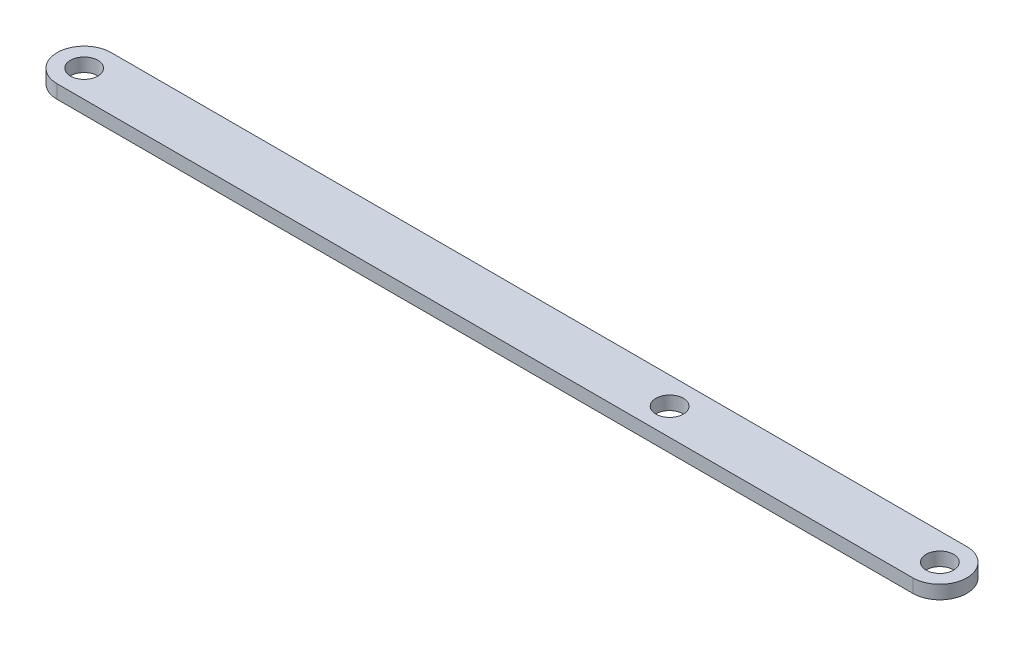
ISO-10303-21;
HEADER;
FILE_DESCRIPTION(('STEP AP214'),'2;1');
FILE_NAME('part.step','',(''),(''),'','','');
FILE_SCHEMA(('AUTOMOTIVE_DESIGN { 1 0 10303 214 1 1 1 1 }'));
ENDSEC;
DATA;
#1=APPLICATION_CONTEXT('core data for automotive mechanical design processes');
#2=APPLICATION_PROTOCOL_DEFINITION('international standard','automotive_design',2000,#1);
#3=PRODUCT_CONTEXT('',#1,'mechanical');
#4=PRODUCT('Part','Part','',(#3));
#5=PRODUCT_RELATED_PRODUCT_CATEGORY('part','',(#4));
#6=PRODUCT_DEFINITION_FORMATION('','',#4);
#7=PRODUCT_DEFINITION_CONTEXT('part definition',#1,'design');
#8=PRODUCT_DEFINITION('design','',#6,#7);
#9=PRODUCT_DEFINITION_SHAPE('','',#8);
#10=(LENGTH_UNIT() NAMED_UNIT(*) SI_UNIT(.MILLI.,.METRE.));
#11=(NAMED_UNIT(*) PLANE_ANGLE_UNIT() SI_UNIT($,.RADIAN.));
#12=(NAMED_UNIT(*) SI_UNIT($,.STERADIAN.) SOLID_ANGLE_UNIT());
#13=UNCERTAINTY_MEASURE_WITH_UNIT(LENGTH_MEASURE(1.E-05),#10,'distance_accuracy_value','');
#14=(GEOMETRIC_REPRESENTATION_CONTEXT(3) GLOBAL_UNCERTAINTY_ASSIGNED_CONTEXT((#13)) GLOBAL_UNIT_ASSIGNED_CONTEXT((#10,
#11,#12)) REPRESENTATION_CONTEXT('',''));
#15=CARTESIAN_POINT('',(0.,0.,0.));
#16=DIRECTION('',(0.,0.,1.));
#17=DIRECTION('',(1.,0.,0.));
#18=AXIS2_PLACEMENT_3D('',#15,#16,#17);
#19=CARTESIAN_POINT('',(0.,3.,0.));
#20=DIRECTION('',(0.,1.,0.));
#21=DIRECTION('',(0.,0.,1.));
#22=AXIS2_PLACEMENT_3D('',#19,#20,#21);
#23=PLANE('',#22);
#24=CARTESIAN_POINT('',(130.,3.,0.));
#25=DIRECTION('',(0.,1.,0.));
#26=DIRECTION('',(0.,0.,1.));
#27=AXIS2_PLACEMENT_3D('',#24,#25,#26);
#28=CIRCLE('',#27,3.04999999999999);
#29=CARTESIAN_POINT('',(130.,3.,3.04999999999999));
#30=VERTEX_POINT('',#29);
#31=EDGE_CURVE('E123',#30,#30,#28,.T.);
#32=ORIENTED_EDGE('',*,*,#31,.F.);
#33=EDGE_LOOP('',(#32));
#34=FACE_BOUND('',#33,.T.);
#35=CARTESIAN_POINT('',(0.,3.,0.));
#36=DIRECTION('',(0.,1.,0.));
#37=DIRECTION('',(0.,0.,1.));
#38=AXIS2_PLACEMENT_3D('',#35,#36,#37);
#39=CIRCLE('',#38,6.);
#40=CARTESIAN_POINT('',(0.,3.,-6.));
#41=VERTEX_POINT('',#40);
#42=CARTESIAN_POINT('',(0.,3.,6.));
#43=VERTEX_POINT('',#42);
#44=EDGE_CURVE('E93',#41,#43,#39,.T.);
#45=ORIENTED_EDGE('',*,*,#44,.T.);
#46=DIRECTION('',(1.,0.,0.));
#47=VECTOR('',#46,1.);
#48=CARTESIAN_POINT('',(0.,3.,6.));
#49=LINE('',#48,#47);
#50=CARTESIAN_POINT('',(190.,3.,6.));
#51=VERTEX_POINT('',#50);
#52=EDGE_CURVE('E88',#43,#51,#49,.T.);
#53=ORIENTED_EDGE('',*,*,#52,.T.);
#54=CARTESIAN_POINT('',(190.,3.,0.));
#55=DIRECTION('',(0.,1.,0.));
#56=DIRECTION('',(0.,0.,1.));
#57=AXIS2_PLACEMENT_3D('',#54,#55,#56);
#58=CIRCLE('',#57,6.);
#59=CARTESIAN_POINT('',(190.,3.,-6.));
#60=VERTEX_POINT('',#59);
#61=EDGE_CURVE('E91',#51,#60,#58,.T.);
#62=ORIENTED_EDGE('',*,*,#61,.T.);
#63=DIRECTION('',(-1.,0.,0.));
#64=VECTOR('',#63,1.);
#65=CARTESIAN_POINT('',(0.,3.,-6.));
#66=LINE('',#65,#64);
#67=EDGE_CURVE('E58',#60,#41,#66,.T.);
#68=ORIENTED_EDGE('',*,*,#67,.T.);
#69=EDGE_LOOP('',(#45,#53,#62,#68));
#70=FACE_BOUND('',#69,.T.);
#71=CARTESIAN_POINT('',(0.,3.,0.));
#72=DIRECTION('',(0.,1.,0.));
#73=DIRECTION('',(0.,0.,1.));
#74=AXIS2_PLACEMENT_3D('',#71,#72,#73);
#75=CIRCLE('',#74,3.05);
#76=CARTESIAN_POINT('',(0.,3.,3.05));
#77=VERTEX_POINT('',#76);
#78=EDGE_CURVE('E108',#77,#77,#75,.T.);
#79=ORIENTED_EDGE('',*,*,#78,.F.);
#80=EDGE_LOOP('',(#79));
#81=FACE_BOUND('',#80,.T.);
#82=CARTESIAN_POINT('',(190.,3.,0.));
#83=DIRECTION('',(0.,1.,0.));
#84=DIRECTION('',(0.,0.,1.));
#85=AXIS2_PLACEMENT_3D('',#82,#83,#84);
#86=CIRCLE('',#85,3.04999999999999);
#87=CARTESIAN_POINT('',(190.,3.,3.04999999999999));
#88=VERTEX_POINT('',#87);
#89=EDGE_CURVE('E129',#88,#88,#86,.T.);
#90=ORIENTED_EDGE('',*,*,#89,.F.);
#91=EDGE_LOOP('',(#90));
#92=FACE_BOUND('',#91,.T.);
#93=ADVANCED_FACE('F41',(#34,#70,#81,#92),#23,.T.);
#94=CARTESIAN_POINT('',(0.,0.,0.));
#95=DIRECTION('',(0.,1.,0.));
#96=DIRECTION('',(0.,0.,1.));
#97=AXIS2_PLACEMENT_3D('',#94,#95,#96);
#98=PLANE('',#97);
#99=CARTESIAN_POINT('',(0.,0.,0.));
#100=DIRECTION('',(0.,1.,0.));
#101=DIRECTION('',(0.,0.,1.));
#102=AXIS2_PLACEMENT_3D('',#99,#100,#101);
#103=CIRCLE('',#102,6.);
#104=CARTESIAN_POINT('',(0.,0.,-6.));
#105=VERTEX_POINT('',#104);
#106=CARTESIAN_POINT('',(0.,0.,6.));
#107=VERTEX_POINT('',#106);
#108=EDGE_CURVE('E105',#105,#107,#103,.T.);
#109=ORIENTED_EDGE('',*,*,#108,.F.);
#110=DIRECTION('',(-1.,0.,0.));
#111=VECTOR('',#110,1.);
#112=CARTESIAN_POINT('',(0.,0.,-6.));
#113=LINE('',#112,#111);
#114=CARTESIAN_POINT('',(190.,0.,-6.));
#115=VERTEX_POINT('',#114);
#116=EDGE_CURVE('E81',#115,#105,#113,.T.);
#117=ORIENTED_EDGE('',*,*,#116,.F.);
#118=CARTESIAN_POINT('',(190.,0.,0.));
#119=DIRECTION('',(0.,1.,0.));
#120=DIRECTION('',(0.,0.,1.));
#121=AXIS2_PLACEMENT_3D('',#118,#119,#120);
#122=CIRCLE('',#121,6.);
#123=CARTESIAN_POINT('',(190.,0.,6.));
#124=VERTEX_POINT('',#123);
#125=EDGE_CURVE('E75',#124,#115,#122,.T.);
#126=ORIENTED_EDGE('',*,*,#125,.F.);
#127=DIRECTION('',(1.,0.,0.));
#128=VECTOR('',#127,1.);
#129=CARTESIAN_POINT('',(0.,0.,6.));
#130=LINE('',#129,#128);
#131=EDGE_CURVE('E97',#107,#124,#130,.T.);
#132=ORIENTED_EDGE('',*,*,#131,.F.);
#133=EDGE_LOOP('',(#109,#117,#126,#132));
#134=FACE_BOUND('',#133,.T.);
#135=CARTESIAN_POINT('',(0.,0.,0.));
#136=DIRECTION('',(0.,1.,0.));
#137=DIRECTION('',(0.,0.,1.));
#138=AXIS2_PLACEMENT_3D('',#135,#136,#137);
#139=CIRCLE('',#138,3.05);
#140=CARTESIAN_POINT('',(0.,0.,3.05));
#141=VERTEX_POINT('',#140);
#142=EDGE_CURVE('E120',#141,#141,#139,.T.);
#143=ORIENTED_EDGE('',*,*,#142,.T.);
#144=EDGE_LOOP('',(#143));
#145=FACE_BOUND('',#144,.T.);
#146=CARTESIAN_POINT('',(130.,0.,0.));
#147=DIRECTION('',(0.,1.,0.));
#148=DIRECTION('',(0.,0.,1.));
#149=AXIS2_PLACEMENT_3D('',#146,#147,#148);
#150=CIRCLE('',#149,3.04999999999999);
#151=CARTESIAN_POINT('',(130.,0.,3.04999999999999));
#152=VERTEX_POINT('',#151);
#153=EDGE_CURVE('E126',#152,#152,#150,.T.);
#154=ORIENTED_EDGE('',*,*,#153,.T.);
#155=EDGE_LOOP('',(#154));
#156=FACE_BOUND('',#155,.T.);
#157=CARTESIAN_POINT('',(190.,0.,0.));
#158=DIRECTION('',(0.,1.,0.));
#159=DIRECTION('',(0.,0.,1.));
#160=AXIS2_PLACEMENT_3D('',#157,#158,#159);
#161=CIRCLE('',#160,3.04999999999999);
#162=CARTESIAN_POINT('',(190.,0.,3.04999999999999));
#163=VERTEX_POINT('',#162);
#164=EDGE_CURVE('E132',#163,#163,#161,.T.);
#165=ORIENTED_EDGE('',*,*,#164,.T.);
#166=EDGE_LOOP('',(#165));
#167=FACE_BOUND('',#166,.T.);
#168=ADVANCED_FACE('F116',(#134,#145,#156,#167),#98,.F.);
#169=CARTESIAN_POINT('',(0.,3.,0.));
#170=DIRECTION('',(0.,-1.,0.));
#171=DIRECTION('',(0.,0.,-1.));
#172=AXIS2_PLACEMENT_3D('',#169,#170,#171);
#173=CYLINDRICAL_SURFACE('',#172,6.);
#174=ORIENTED_EDGE('',*,*,#108,.T.);
#175=DIRECTION('',(0.,-1.,0.));
#176=VECTOR('',#175,1.);
#177=CARTESIAN_POINT('',(0.,3.,6.));
#178=LINE('',#177,#176);
#179=EDGE_CURVE('E11',#43,#107,#178,.T.);
#180=ORIENTED_EDGE('',*,*,#179,.F.);
#181=ORIENTED_EDGE('',*,*,#44,.F.);
#182=DIRECTION('',(0.,-1.,0.));
#183=VECTOR('',#182,1.);
#184=CARTESIAN_POINT('',(0.,3.,-6.));
#185=LINE('',#184,#183);
#186=EDGE_CURVE('E101',#41,#105,#185,.T.);
#187=ORIENTED_EDGE('',*,*,#186,.T.);
#188=EDGE_LOOP('',(#174,#180,#181,#187));
#189=FACE_BOUND('',#188,.T.);
#190=ADVANCED_FACE('F43',(#189),#173,.T.);
#191=CARTESIAN_POINT('',(0.,3.,6.));
#192=DIRECTION('',(0.,0.,-1.));
#193=DIRECTION('',(-1.,0.,0.));
#194=AXIS2_PLACEMENT_3D('',#191,#192,#193);
#195=PLANE('',#194);
#196=ORIENTED_EDGE('',*,*,#131,.T.);
#197=DIRECTION('',(0.,-1.,0.));
#198=VECTOR('',#197,1.);
#199=CARTESIAN_POINT('',(190.,3.,6.));
#200=LINE('',#199,#198);
#201=EDGE_CURVE('E50',#51,#124,#200,.T.);
#202=ORIENTED_EDGE('',*,*,#201,.F.);
#203=ORIENTED_EDGE('',*,*,#52,.F.);
#204=ORIENTED_EDGE('',*,*,#179,.T.);
#205=EDGE_LOOP('',(#196,#202,#203,#204));
#206=FACE_BOUND('',#205,.T.);
#207=ADVANCED_FACE('F96',(#206),#195,.F.);
#208=CARTESIAN_POINT('',(190.,3.,0.));
#209=DIRECTION('',(0.,-1.,0.));
#210=DIRECTION('',(0.,0.,-1.));
#211=AXIS2_PLACEMENT_3D('',#208,#209,#210);
#212=CYLINDRICAL_SURFACE('',#211,6.);
#213=ORIENTED_EDGE('',*,*,#125,.T.);
#214=DIRECTION('',(0.,-1.,0.));
#215=VECTOR('',#214,1.);
#216=CARTESIAN_POINT('',(190.,3.,-6.));
#217=LINE('',#216,#215);
#218=EDGE_CURVE('E98',#60,#115,#217,.T.);
#219=ORIENTED_EDGE('',*,*,#218,.F.);
#220=ORIENTED_EDGE('',*,*,#61,.F.);
#221=ORIENTED_EDGE('',*,*,#201,.T.);
#222=EDGE_LOOP('',(#213,#219,#220,#221));
#223=FACE_BOUND('',#222,.T.);
#224=ADVANCED_FACE('F99',(#223),#212,.T.);
#225=CARTESIAN_POINT('',(0.,3.,-6.));
#226=DIRECTION('',(0.,0.,1.));
#227=DIRECTION('',(1.,0.,0.));
#228=AXIS2_PLACEMENT_3D('',#225,#226,#227);
#229=PLANE('',#228);
#230=ORIENTED_EDGE('',*,*,#116,.T.);
#231=ORIENTED_EDGE('',*,*,#186,.F.);
#232=ORIENTED_EDGE('',*,*,#67,.F.);
#233=ORIENTED_EDGE('',*,*,#218,.T.);
#234=EDGE_LOOP('',(#230,#231,#232,#233));
#235=FACE_BOUND('',#234,.T.);
#236=ADVANCED_FACE('F113',(#235),#229,.F.);
#237=CARTESIAN_POINT('',(0.,3.,0.));
#238=DIRECTION('',(0.,-1.,0.));
#239=DIRECTION('',(0.,0.,-1.));
#240=AXIS2_PLACEMENT_3D('',#237,#238,#239);
#241=CYLINDRICAL_SURFACE('',#240,3.05);
#242=ORIENTED_EDGE('',*,*,#78,.T.);
#243=EDGE_LOOP('',(#242));
#244=FACE_BOUND('',#243,.T.);
#245=ORIENTED_EDGE('',*,*,#142,.F.);
#246=EDGE_LOOP('',(#245));
#247=FACE_BOUND('',#246,.T.);
#248=ADVANCED_FACE('F150',(#244,#247),#241,.F.);
#249=CARTESIAN_POINT('',(130.,3.,0.));
#250=DIRECTION('',(0.,-1.,0.));
#251=DIRECTION('',(0.,0.,-1.));
#252=AXIS2_PLACEMENT_3D('',#249,#250,#251);
#253=CYLINDRICAL_SURFACE('',#252,3.04999999999999);
#254=ORIENTED_EDGE('',*,*,#31,.T.);
#255=EDGE_LOOP('',(#254));
#256=FACE_BOUND('',#255,.T.);
#257=ORIENTED_EDGE('',*,*,#153,.F.);
#258=EDGE_LOOP('',(#257));
#259=FACE_BOUND('',#258,.T.);
#260=ADVANCED_FACE('F195',(#256,#259),#253,.F.);
#261=CARTESIAN_POINT('',(190.,3.,0.));
#262=DIRECTION('',(0.,-1.,0.));
#263=DIRECTION('',(0.,0.,-1.));
#264=AXIS2_PLACEMENT_3D('',#261,#262,#263);
#265=CYLINDRICAL_SURFACE('',#264,3.04999999999999);
#266=ORIENTED_EDGE('',*,*,#89,.T.);
#267=EDGE_LOOP('',(#266));
#268=FACE_BOUND('',#267,.T.);
#269=ORIENTED_EDGE('',*,*,#164,.F.);
#270=EDGE_LOOP('',(#269));
#271=FACE_BOUND('',#270,.T.);
#272=ADVANCED_FACE('F138',(#268,#271),#265,.F.);
#273=CLOSED_SHELL('',(#93,#168,#190,#207,#224,#236,#248,#260,#272));
#274=MANIFOLD_SOLID_BREP('B2',#273);
#275=ADVANCED_BREP_SHAPE_REPRESENTATION('',(#18,#274),#14);
#276=SHAPE_DEFINITION_REPRESENTATION(#9,#275);
ENDSEC;
END-ISO-10303-21;
